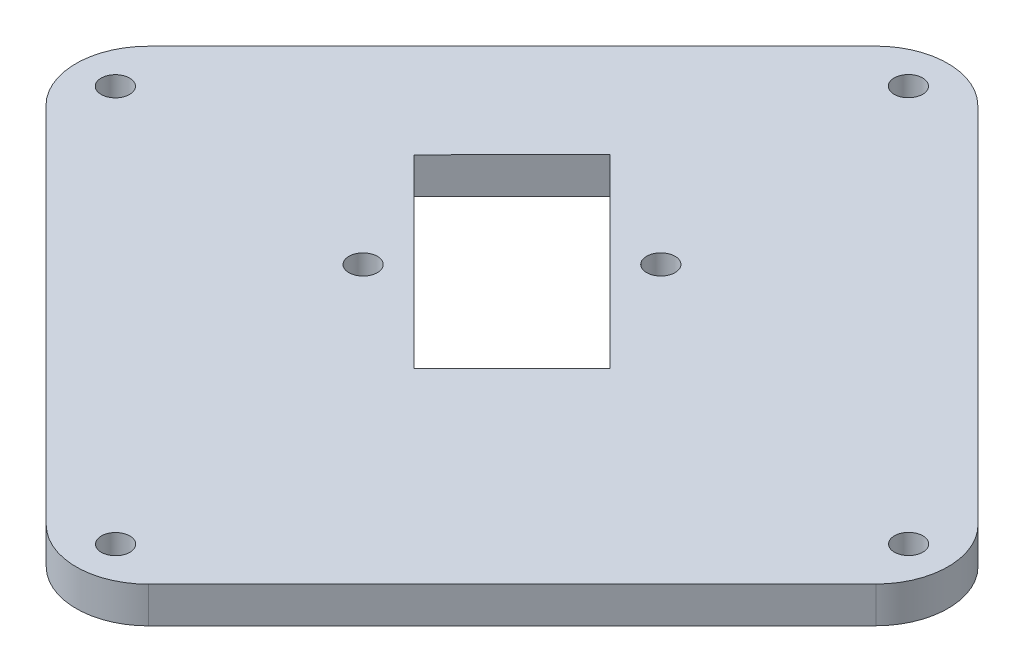
ISO-10303-21;
HEADER;
FILE_DESCRIPTION(('STEP AP214'),'2;1');
FILE_NAME('part.step','',(''),(''),'','','');
FILE_SCHEMA(('AUTOMOTIVE_DESIGN { 1 0 10303 214 1 1 1 1 }'));
ENDSEC;
DATA;
#1=APPLICATION_CONTEXT('core data for automotive mechanical design processes');
#2=APPLICATION_PROTOCOL_DEFINITION('international standard','automotive_design',2000,#1);
#3=PRODUCT_CONTEXT('',#1,'mechanical');
#4=PRODUCT('Part','Part','',(#3));
#5=PRODUCT_RELATED_PRODUCT_CATEGORY('part','',(#4));
#6=PRODUCT_DEFINITION_FORMATION('','',#4);
#7=PRODUCT_DEFINITION_CONTEXT('part definition',#1,'design');
#8=PRODUCT_DEFINITION('design','',#6,#7);
#9=PRODUCT_DEFINITION_SHAPE('','',#8);
#10=(LENGTH_UNIT() NAMED_UNIT(*) SI_UNIT(.MILLI.,.METRE.));
#11=(NAMED_UNIT(*) PLANE_ANGLE_UNIT() SI_UNIT($,.RADIAN.));
#12=(NAMED_UNIT(*) SI_UNIT($,.STERADIAN.) SOLID_ANGLE_UNIT());
#13=UNCERTAINTY_MEASURE_WITH_UNIT(LENGTH_MEASURE(1.E-05),#10,'distance_accuracy_value','');
#14=(GEOMETRIC_REPRESENTATION_CONTEXT(3) GLOBAL_UNCERTAINTY_ASSIGNED_CONTEXT((#13)) GLOBAL_UNIT_ASSIGNED_CONTEXT((#10,
#11,#12)) REPRESENTATION_CONTEXT('',''));
#15=CARTESIAN_POINT('',(0.,0.,0.));
#16=DIRECTION('',(0.,0.,1.));
#17=DIRECTION('',(1.,0.,0.));
#18=AXIS2_PLACEMENT_3D('',#15,#16,#17);
#19=CARTESIAN_POINT('',(0.,3.175,0.));
#20=DIRECTION('',(0.,1.,0.));
#21=DIRECTION('',(0.,0.,1.));
#22=AXIS2_PLACEMENT_3D('',#19,#20,#21);
#23=PLANE('',#22);
#24=CARTESIAN_POINT('',(49.990509246549,3.175,-3.32599943174655));
#25=DIRECTION('',(0.,1.,0.));
#26=DIRECTION('',(0.,0.,1.));
#27=AXIS2_PLACEMENT_3D('',#24,#25,#26);
#28=CIRCLE('',#27,1.25);
#29=CARTESIAN_POINT('',(49.990509246549,3.175,-2.07599943174655));
#30=VERTEX_POINT('',#29);
#31=EDGE_CURVE('E172',#30,#30,#28,.T.);
#32=ORIENTED_EDGE('',*,*,#31,.F.);
#33=EDGE_LOOP('',(#32));
#34=FACE_BOUND('',#33,.T.);
#35=CARTESIAN_POINT('',(-19.6693987929127,3.175,-3.30403545654676));
#36=DIRECTION('',(0.,1.,0.));
#37=DIRECTION('',(0.,0.,1.));
#38=AXIS2_PLACEMENT_3D('',#35,#36,#37);
#39=CIRCLE('',#38,1.25);
#40=CARTESIAN_POINT('',(-19.6693987929127,3.175,-2.05403545654676));
#41=VERTEX_POINT('',#40);
#42=EDGE_CURVE('E184',#41,#41,#39,.T.);
#43=ORIENTED_EDGE('',*,*,#42,.F.);
#44=EDGE_LOOP('',(#43));
#45=FACE_BOUND('',#44,.T.);
#46=CARTESIAN_POINT('',(4.76898538185796,3.175,-0.628904830785669));
#47=DIRECTION('',(0.,1.,0.));
#48=DIRECTION('',(0.,0.,1.));
#49=AXIS2_PLACEMENT_3D('',#46,#47,#48);
#50=CIRCLE('',#49,1.25);
#51=CARTESIAN_POINT('',(4.76898538185796,3.175,0.62109516921433));
#52=VERTEX_POINT('',#51);
#53=EDGE_CURVE('E196',#52,#52,#50,.T.);
#54=ORIENTED_EDGE('',*,*,#53,.F.);
#55=EDGE_LOOP('',(#54));
#56=FACE_BOUND('',#55,.T.);
#57=DIRECTION('',(-0.706883853499556,0.,0.707329638613863));
#58=VECTOR('',#57,1.);
#59=CARTESIAN_POINT('',(15.1476582908573,3.175,-44.2388174032666));
#60=LINE('',#59,#58);
#61=CARTESIAN_POINT('',(10.6589458211352,3.175,-39.7472741980685));
#62=VERTEX_POINT('',#61);
#63=CARTESIAN_POINT('',(-21.2745322607073,3.175,-7.79365777368722));
#64=VERTEX_POINT('',#63);
#65=EDGE_CURVE('E210',#62,#64,#60,.T.);
#66=ORIENTED_EDGE('',*,*,#65,.T.);
#67=CARTESIAN_POINT('',(-16.7829890555093,3.175,-3.30494530396506));
#68=DIRECTION('',(0.,1.,0.));
#69=DIRECTION('',(0.,0.,1.));
#70=AXIS2_PLACEMENT_3D('',#67,#68,#69);
#71=CIRCLE('',#70,6.35);
#72=CARTESIAN_POINT('',(-21.2717015252314,3.175,1.18659790123297));
#73=VERTEX_POINT('',#72);
#74=EDGE_CURVE('E245',#64,#73,#71,.T.);
#75=ORIENTED_EDGE('',*,*,#74,.T.);
#76=DIRECTION('',(0.707329638613863,0.,0.706883853499556));
#77=VECTOR('',#76,1.);
#78=CARTESIAN_POINT('',(-25.7632447304295,3.175,-3.30211456848921));
#79=LINE('',#78,#77);
#80=CARTESIAN_POINT('',(10.6819148991499,3.175,33.1200759830754));
#81=VERTEX_POINT('',#80);
#82=EDGE_CURVE('E202',#73,#81,#79,.T.);
#83=ORIENTED_EDGE('',*,*,#82,.T.);
#84=CARTESIAN_POINT('',(15.170627368872,3.175,28.6285327778774));
#85=DIRECTION('',(0.,1.,0.));
#86=DIRECTION('',(0.,0.,1.));
#87=AXIS2_PLACEMENT_3D('',#84,#85,#86);
#88=CIRCLE('',#87,6.35);
#89=CARTESIAN_POINT('',(19.6621705740701,3.175,33.1172452475995));
#90=VERTEX_POINT('',#89);
#91=EDGE_CURVE('E241',#81,#90,#88,.T.);
#92=ORIENTED_EDGE('',*,*,#91,.T.);
#93=DIRECTION('',(0.706883853499556,0.,-0.707329638613863));
#94=VECTOR('',#93,1.);
#95=CARTESIAN_POINT('',(15.1734581043479,3.175,37.6087884527976));
#96=LINE('',#95,#94);
#97=CARTESIAN_POINT('',(51.5956486559125,3.175,1.16362882321828));
#98=VERTEX_POINT('',#97);
#99=EDGE_CURVE('E205',#90,#98,#96,.T.);
#100=ORIENTED_EDGE('',*,*,#99,.T.);
#101=CARTESIAN_POINT('',(47.1041054507145,3.175,-3.3250836465039));
#102=DIRECTION('',(0.,1.,0.));
#103=DIRECTION('',(0.,0.,1.));
#104=AXIS2_PLACEMENT_3D('',#101,#102,#103);
#105=CIRCLE('',#104,6.35);
#106=CARTESIAN_POINT('',(51.5928179204367,3.175,-7.81662685170192));
#107=VERTEX_POINT('',#106);
#108=EDGE_CURVE('E55',#98,#107,#105,.T.);
#109=ORIENTED_EDGE('',*,*,#108,.T.);
#110=DIRECTION('',(-0.707329638613863,0.,-0.706883853499556));
#111=VECTOR('',#110,1.);
#112=CARTESIAN_POINT('',(15.1476582908573,3.175,-44.2388174032666));
#113=LINE('',#112,#111);
#114=CARTESIAN_POINT('',(19.6392014960554,3.175,-39.7501049335444));
#115=VERTEX_POINT('',#114);
#116=EDGE_CURVE('E208',#107,#115,#113,.T.);
#117=ORIENTED_EDGE('',*,*,#116,.T.);
#118=CARTESIAN_POINT('',(15.1504890263332,3.175,-35.2585617283464));
#119=DIRECTION('',(0.,1.,0.));
#120=DIRECTION('',(0.,0.,1.));
#121=AXIS2_PLACEMENT_3D('',#118,#119,#120);
#122=CIRCLE('',#121,6.35);
#123=EDGE_CURVE('E243',#115,#62,#122,.T.);
#124=ORIENTED_EDGE('',*,*,#123,.T.);
#125=EDGE_LOOP('',(#66,#75,#83,#92,#100,#109,#117,#124));
#126=FACE_BOUND('',#125,.T.);
#127=CARTESIAN_POINT('',(17.8401160936888,3.175,-13.7082786443225));
#128=DIRECTION('',(0.,1.,0.));
#129=DIRECTION('',(0.,0.,1.));
#130=AXIS2_PLACEMENT_3D('',#127,#128,#129);
#131=CIRCLE('',#130,1.25);
#132=CARTESIAN_POINT('',(17.8401160936888,3.175,-12.4582786443225));
#133=VERTEX_POINT('',#132);
#134=EDGE_CURVE('E190',#133,#133,#131,.T.);
#135=ORIENTED_EDGE('',*,*,#134,.F.);
#136=EDGE_LOOP('',(#135));
#137=FACE_BOUND('',#136,.T.);
#138=CARTESIAN_POINT('',(15.1495791789148,3.175,-38.1449714657498));
#139=DIRECTION('',(0.,1.,0.));
#140=DIRECTION('',(0.,0.,1.));
#141=AXIS2_PLACEMENT_3D('',#138,#139,#140);
#142=CIRCLE('',#141,1.25);
#143=CARTESIAN_POINT('',(15.1495791789148,3.175,-36.8949714657498));
#144=VERTEX_POINT('',#143);
#145=EDGE_CURVE('E178',#144,#144,#142,.T.);
#146=ORIENTED_EDGE('',*,*,#145,.F.);
#147=EDGE_LOOP('',(#146));
#148=FACE_BOUND('',#147,.T.);
#149=CARTESIAN_POINT('',(15.1715372162903,3.175,31.5149425152809));
#150=DIRECTION('',(0.,1.,0.));
#151=DIRECTION('',(0.,0.,1.));
#152=AXIS2_PLACEMENT_3D('',#149,#150,#151);
#153=CIRCLE('',#152,1.25);
#154=CARTESIAN_POINT('',(15.1715372162903,3.175,32.7649425152809));
#155=VERTEX_POINT('',#154);
#156=EDGE_CURVE('E166',#155,#155,#153,.T.);
#157=ORIENTED_EDGE('',*,*,#156,.F.);
#158=EDGE_LOOP('',(#157));
#159=FACE_BOUND('',#158,.T.);
#160=DIRECTION('',(-0.707329638613864,0.,-0.706883853499555));
#161=VECTOR('',#160,1.);
#162=CARTESIAN_POINT('',(7.26333532872844,3.175,-19.823469226795));
#163=LINE('',#162,#161);
#164=CARTESIAN_POINT('',(23.517770424075,3.175,-3.57927827337517));
#165=VERTEX_POINT('',#164);
#166=CARTESIAN_POINT('',(7.26333532872844,3.175,-19.823469226795));
#167=VERTEX_POINT('',#166);
#168=EDGE_CURVE('E135',#165,#167,#163,.T.);
#169=ORIENTED_EDGE('',*,*,#168,.F.);
#170=DIRECTION('',(0.706883853499556,0.,-0.707329638613863));
#171=VECTOR('',#170,1.);
#172=CARTESIAN_POINT('',(23.517770424075,3.175,-3.57927827337517));
#173=LINE('',#172,#171);
#174=CARTESIAN_POINT('',(14.9015631337689,3.175,5.04236269168921));
#175=VERTEX_POINT('',#174);
#176=EDGE_CURVE('E125',#175,#165,#173,.T.);
#177=ORIENTED_EDGE('',*,*,#176,.F.);
#178=DIRECTION('',(0.707329638613864,0.,0.706883853499555));
#179=VECTOR('',#178,1.);
#180=CARTESIAN_POINT('',(14.9015631337689,3.175,5.04236269168921));
#181=LINE('',#180,#179);
#182=CARTESIAN_POINT('',(-1.35287196157764,3.175,-11.2018282617306));
#183=VERTEX_POINT('',#182);
#184=EDGE_CURVE('E150',#183,#175,#181,.T.);
#185=ORIENTED_EDGE('',*,*,#184,.F.);
#186=DIRECTION('',(-0.706883853499555,0.,0.707329638613864));
#187=VECTOR('',#186,1.);
#188=CARTESIAN_POINT('',(-1.35287196157764,3.175,-11.2018282617306));
#189=LINE('',#188,#187);
#190=EDGE_CURVE('E148',#167,#183,#189,.T.);
#191=ORIENTED_EDGE('',*,*,#190,.F.);
#192=EDGE_LOOP('',(#169,#177,#185,#191));
#193=FACE_BOUND('',#192,.T.);
#194=ADVANCED_FACE('F33',(#34,#45,#56,#126,#137,#148,#159,#193),#23,.T.);
#195=CARTESIAN_POINT('',(0.,0.,0.));
#196=DIRECTION('',(0.,1.,0.));
#197=DIRECTION('',(0.,0.,1.));
#198=AXIS2_PLACEMENT_3D('',#195,#196,#197);
#199=PLANE('',#198);
#200=CARTESIAN_POINT('',(15.1715372162903,0.,31.5149425152809));
#201=DIRECTION('',(0.,1.,0.));
#202=DIRECTION('',(0.,0.,1.));
#203=AXIS2_PLACEMENT_3D('',#200,#201,#202);
#204=CIRCLE('',#203,1.25);
#205=CARTESIAN_POINT('',(15.1715372162903,0.,32.7649425152809));
#206=VERTEX_POINT('',#205);
#207=EDGE_CURVE('E143',#206,#206,#204,.T.);
#208=ORIENTED_EDGE('',*,*,#207,.T.);
#209=EDGE_LOOP('',(#208));
#210=FACE_BOUND('',#209,.T.);
#211=CARTESIAN_POINT('',(49.990509246549,0.,-3.32599943174655));
#212=DIRECTION('',(0.,1.,0.));
#213=DIRECTION('',(0.,0.,1.));
#214=AXIS2_PLACEMENT_3D('',#211,#212,#213);
#215=CIRCLE('',#214,1.25);
#216=CARTESIAN_POINT('',(49.990509246549,0.,-2.07599943174655));
#217=VERTEX_POINT('',#216);
#218=EDGE_CURVE('E169',#217,#217,#215,.T.);
#219=ORIENTED_EDGE('',*,*,#218,.T.);
#220=EDGE_LOOP('',(#219));
#221=FACE_BOUND('',#220,.T.);
#222=CARTESIAN_POINT('',(15.1495791789148,0.,-38.1449714657498));
#223=DIRECTION('',(0.,1.,0.));
#224=DIRECTION('',(0.,0.,1.));
#225=AXIS2_PLACEMENT_3D('',#222,#223,#224);
#226=CIRCLE('',#225,1.25);
#227=CARTESIAN_POINT('',(15.1495791789148,0.,-36.8949714657498));
#228=VERTEX_POINT('',#227);
#229=EDGE_CURVE('E175',#228,#228,#226,.T.);
#230=ORIENTED_EDGE('',*,*,#229,.T.);
#231=EDGE_LOOP('',(#230));
#232=FACE_BOUND('',#231,.T.);
#233=CARTESIAN_POINT('',(-19.6693987929127,0.,-3.30403545654676));
#234=DIRECTION('',(0.,1.,0.));
#235=DIRECTION('',(0.,0.,1.));
#236=AXIS2_PLACEMENT_3D('',#233,#234,#235);
#237=CIRCLE('',#236,1.25);
#238=CARTESIAN_POINT('',(-19.6693987929127,0.,-2.05403545654676));
#239=VERTEX_POINT('',#238);
#240=EDGE_CURVE('E181',#239,#239,#237,.T.);
#241=ORIENTED_EDGE('',*,*,#240,.T.);
#242=EDGE_LOOP('',(#241));
#243=FACE_BOUND('',#242,.T.);
#244=CARTESIAN_POINT('',(17.8401160936888,0.,-13.7082786443225));
#245=DIRECTION('',(0.,1.,0.));
#246=DIRECTION('',(0.,0.,1.));
#247=AXIS2_PLACEMENT_3D('',#244,#245,#246);
#248=CIRCLE('',#247,1.25);
#249=CARTESIAN_POINT('',(17.8401160936888,0.,-12.4582786443225));
#250=VERTEX_POINT('',#249);
#251=EDGE_CURVE('E187',#250,#250,#248,.T.);
#252=ORIENTED_EDGE('',*,*,#251,.T.);
#253=EDGE_LOOP('',(#252));
#254=FACE_BOUND('',#253,.T.);
#255=CARTESIAN_POINT('',(4.76898538185796,0.,-0.628904830785669));
#256=DIRECTION('',(0.,1.,0.));
#257=DIRECTION('',(0.,0.,1.));
#258=AXIS2_PLACEMENT_3D('',#255,#256,#257);
#259=CIRCLE('',#258,1.25);
#260=CARTESIAN_POINT('',(4.76898538185796,0.,0.62109516921433));
#261=VERTEX_POINT('',#260);
#262=EDGE_CURVE('E193',#261,#261,#259,.T.);
#263=ORIENTED_EDGE('',*,*,#262,.T.);
#264=EDGE_LOOP('',(#263));
#265=FACE_BOUND('',#264,.T.);
#266=DIRECTION('',(0.707329638613863,0.,0.706883853499556));
#267=VECTOR('',#266,1.);
#268=CARTESIAN_POINT('',(-25.7632447304295,0.,-3.30211456848921));
#269=LINE('',#268,#267);
#270=CARTESIAN_POINT('',(-21.2717015252314,0.,1.18659790123297));
#271=VERTEX_POINT('',#270);
#272=CARTESIAN_POINT('',(10.6819148991499,0.,33.1200759830754));
#273=VERTEX_POINT('',#272);
#274=EDGE_CURVE('E199',#271,#273,#269,.T.);
#275=ORIENTED_EDGE('',*,*,#274,.F.);
#276=CARTESIAN_POINT('',(-16.7829890555093,0.,-3.30494530396506));
#277=DIRECTION('',(0.,1.,0.));
#278=DIRECTION('',(0.,0.,1.));
#279=AXIS2_PLACEMENT_3D('',#276,#277,#278);
#280=CIRCLE('',#279,6.35);
#281=CARTESIAN_POINT('',(-21.2745322607073,0.,-7.79365777368722));
#282=VERTEX_POINT('',#281);
#283=EDGE_CURVE('E233',#271,#282,#280,.F.);
#284=ORIENTED_EDGE('',*,*,#283,.T.);
#285=DIRECTION('',(-0.706883853499556,0.,0.707329638613863));
#286=VECTOR('',#285,1.);
#287=CARTESIAN_POINT('',(15.1476582908573,0.,-44.2388174032666));
#288=LINE('',#287,#286);
#289=CARTESIAN_POINT('',(10.6589458211352,0.,-39.7472741980685));
#290=VERTEX_POINT('',#289);
#291=EDGE_CURVE('E206',#290,#282,#288,.T.);
#292=ORIENTED_EDGE('',*,*,#291,.F.);
#293=CARTESIAN_POINT('',(15.1504890263332,0.,-35.2585617283464));
#294=DIRECTION('',(0.,1.,0.));
#295=DIRECTION('',(0.,0.,1.));
#296=AXIS2_PLACEMENT_3D('',#293,#294,#295);
#297=CIRCLE('',#296,6.35);
#298=CARTESIAN_POINT('',(19.6392014960554,0.,-39.7501049335444));
#299=VERTEX_POINT('',#298);
#300=EDGE_CURVE('E231',#290,#299,#297,.F.);
#301=ORIENTED_EDGE('',*,*,#300,.T.);
#302=DIRECTION('',(-0.707329638613863,0.,-0.706883853499556));
#303=VECTOR('',#302,1.);
#304=CARTESIAN_POINT('',(15.1476582908573,0.,-44.2388174032666));
#305=LINE('',#304,#303);
#306=CARTESIAN_POINT('',(51.5928179204367,0.,-7.81662685170192));
#307=VERTEX_POINT('',#306);
#308=EDGE_CURVE('E219',#307,#299,#305,.T.);
#309=ORIENTED_EDGE('',*,*,#308,.F.);
#310=CARTESIAN_POINT('',(47.1041054507145,0.,-3.3250836465039));
#311=DIRECTION('',(0.,1.,0.));
#312=DIRECTION('',(0.,0.,1.));
#313=AXIS2_PLACEMENT_3D('',#310,#311,#312);
#314=CIRCLE('',#313,6.35);
#315=CARTESIAN_POINT('',(51.5956486559125,0.,1.16362882321828));
#316=VERTEX_POINT('',#315);
#317=EDGE_CURVE('E227',#307,#316,#314,.F.);
#318=ORIENTED_EDGE('',*,*,#317,.T.);
#319=DIRECTION('',(0.706883853499556,0.,-0.707329638613863));
#320=VECTOR('',#319,1.);
#321=CARTESIAN_POINT('',(15.1734581043479,0.,37.6087884527976));
#322=LINE('',#321,#320);
#323=CARTESIAN_POINT('',(19.6621705740701,0.,33.1172452475995));
#324=VERTEX_POINT('',#323);
#325=EDGE_CURVE('E216',#324,#316,#322,.T.);
#326=ORIENTED_EDGE('',*,*,#325,.F.);
#327=CARTESIAN_POINT('',(15.170627368872,0.,28.6285327778774));
#328=DIRECTION('',(0.,1.,0.));
#329=DIRECTION('',(0.,0.,1.));
#330=AXIS2_PLACEMENT_3D('',#327,#328,#329);
#331=CIRCLE('',#330,6.35);
#332=EDGE_CURVE('E229',#324,#273,#331,.F.);
#333=ORIENTED_EDGE('',*,*,#332,.T.);
#334=EDGE_LOOP('',(#275,#284,#292,#301,#309,#318,#326,#333));
#335=FACE_BOUND('',#334,.T.);
#336=DIRECTION('',(0.706883853499556,0.,-0.707329638613863));
#337=VECTOR('',#336,1.);
#338=CARTESIAN_POINT('',(23.517770424075,0.,-3.57927827337517));
#339=LINE('',#338,#337);
#340=CARTESIAN_POINT('',(14.9015631337689,0.,5.04236269168922));
#341=VERTEX_POINT('',#340);
#342=CARTESIAN_POINT('',(23.517770424075,0.,-3.57927827337517));
#343=VERTEX_POINT('',#342);
#344=EDGE_CURVE('E154',#341,#343,#339,.T.);
#345=ORIENTED_EDGE('',*,*,#344,.T.);
#346=DIRECTION('',(-0.707329638613864,0.,-0.706883853499555));
#347=VECTOR('',#346,1.);
#348=CARTESIAN_POINT('',(7.26333532872844,0.,-19.823469226795));
#349=LINE('',#348,#347);
#350=CARTESIAN_POINT('',(7.26333532872844,0.,-19.823469226795));
#351=VERTEX_POINT('',#350);
#352=EDGE_CURVE('E142',#343,#351,#349,.T.);
#353=ORIENTED_EDGE('',*,*,#352,.T.);
#354=DIRECTION('',(-0.706883853499555,0.,0.707329638613864));
#355=VECTOR('',#354,1.);
#356=CARTESIAN_POINT('',(-1.35287196157764,0.,-11.2018282617306));
#357=LINE('',#356,#355);
#358=CARTESIAN_POINT('',(-1.35287196157764,0.,-11.2018282617306));
#359=VERTEX_POINT('',#358);
#360=EDGE_CURVE('E157',#351,#359,#357,.T.);
#361=ORIENTED_EDGE('',*,*,#360,.T.);
#362=DIRECTION('',(0.707329638613864,0.,0.706883853499555));
#363=VECTOR('',#362,1.);
#364=CARTESIAN_POINT('',(14.9015631337689,0.,5.04236269168921));
#365=LINE('',#364,#363);
#366=EDGE_CURVE('E136',#359,#341,#365,.T.);
#367=ORIENTED_EDGE('',*,*,#366,.T.);
#368=EDGE_LOOP('',(#345,#353,#361,#367));
#369=FACE_BOUND('',#368,.T.);
#370=ADVANCED_FACE('F264',(#210,#221,#232,#243,#254,#265,#335,#369),#199,.F.);
#371=CARTESIAN_POINT('',(-25.7632447304295,3.175,-3.30211456848921));
#372=DIRECTION('',(0.706883853499556,0.,-0.707329638613863));
#373=DIRECTION('',(-0.707329638613864,0.,-0.706883853499556));
#374=AXIS2_PLACEMENT_3D('',#371,#372,#373);
#375=PLANE('',#374);
#376=ORIENTED_EDGE('',*,*,#82,.F.);
#377=DIRECTION('',(0.,-1.,0.));
#378=VECTOR('',#377,1.);
#379=CARTESIAN_POINT('',(-21.2717015252314,3.175,1.18659790123297));
#380=LINE('',#379,#378);
#381=EDGE_CURVE('E224',#73,#271,#380,.T.);
#382=ORIENTED_EDGE('',*,*,#381,.T.);
#383=ORIENTED_EDGE('',*,*,#274,.T.);
#384=DIRECTION('',(0.,-1.,0.));
#385=VECTOR('',#384,1.);
#386=CARTESIAN_POINT('',(10.6819148991499,3.175,33.1200759830754));
#387=LINE('',#386,#385);
#388=EDGE_CURVE('E213',#273,#81,#387,.F.);
#389=ORIENTED_EDGE('',*,*,#388,.T.);
#390=EDGE_LOOP('',(#376,#382,#383,#389));
#391=FACE_BOUND('',#390,.T.);
#392=ADVANCED_FACE('F281',(#391),#375,.F.);
#393=CARTESIAN_POINT('',(15.1734581043479,3.175,37.6087884527976));
#394=DIRECTION('',(-0.707329638613863,0.,-0.706883853499556));
#395=DIRECTION('',(-0.706883853499556,0.,0.707329638613863));
#396=AXIS2_PLACEMENT_3D('',#393,#394,#395);
#397=PLANE('',#396);
#398=ORIENTED_EDGE('',*,*,#99,.F.);
#399=DIRECTION('',(0.,-1.,0.));
#400=VECTOR('',#399,1.);
#401=CARTESIAN_POINT('',(19.6621705740701,3.175,33.1172452475995));
#402=LINE('',#401,#400);
#403=EDGE_CURVE('E11',#90,#324,#402,.T.);
#404=ORIENTED_EDGE('',*,*,#403,.T.);
#405=ORIENTED_EDGE('',*,*,#325,.T.);
#406=DIRECTION('',(0.,-1.,0.));
#407=VECTOR('',#406,1.);
#408=CARTESIAN_POINT('',(51.5956486559125,3.175,1.16362882321828));
#409=LINE('',#408,#407);
#410=EDGE_CURVE('E41',#316,#98,#409,.F.);
#411=ORIENTED_EDGE('',*,*,#410,.T.);
#412=EDGE_LOOP('',(#398,#404,#405,#411));
#413=FACE_BOUND('',#412,.T.);
#414=ADVANCED_FACE('F253',(#413),#397,.F.);
#415=CARTESIAN_POINT('',(15.1476582908573,3.175,-44.2388174032666));
#416=DIRECTION('',(-0.706883853499556,0.,0.707329638613863));
#417=DIRECTION('',(0.707329638613863,0.,0.706883853499556));
#418=AXIS2_PLACEMENT_3D('',#415,#416,#417);
#419=PLANE('',#418);
#420=ORIENTED_EDGE('',*,*,#308,.T.);
#421=DIRECTION('',(0.,-1.,0.));
#422=VECTOR('',#421,1.);
#423=CARTESIAN_POINT('',(19.6392014960554,3.175,-39.7501049335444));
#424=LINE('',#423,#422);
#425=EDGE_CURVE('E48',#299,#115,#424,.F.);
#426=ORIENTED_EDGE('',*,*,#425,.T.);
#427=ORIENTED_EDGE('',*,*,#116,.F.);
#428=DIRECTION('',(0.,-1.,0.));
#429=VECTOR('',#428,1.);
#430=CARTESIAN_POINT('',(51.5928179204367,3.175,-7.81662685170193));
#431=LINE('',#430,#429);
#432=EDGE_CURVE('E247',#107,#307,#431,.T.);
#433=ORIENTED_EDGE('',*,*,#432,.T.);
#434=EDGE_LOOP('',(#420,#426,#427,#433));
#435=FACE_BOUND('',#434,.T.);
#436=ADVANCED_FACE('F261',(#435),#419,.F.);
#437=CARTESIAN_POINT('',(15.1476582908573,3.175,-44.2388174032666));
#438=DIRECTION('',(0.707329638613863,0.,0.706883853499556));
#439=DIRECTION('',(0.706883853499556,0.,-0.707329638613863));
#440=AXIS2_PLACEMENT_3D('',#437,#438,#439);
#441=PLANE('',#440);
#442=ORIENTED_EDGE('',*,*,#291,.T.);
#443=DIRECTION('',(0.,-1.,0.));
#444=VECTOR('',#443,1.);
#445=CARTESIAN_POINT('',(-21.2745322607073,3.175,-7.79365777368723));
#446=LINE('',#445,#444);
#447=EDGE_CURVE('E238',#282,#64,#446,.F.);
#448=ORIENTED_EDGE('',*,*,#447,.T.);
#449=ORIENTED_EDGE('',*,*,#65,.F.);
#450=DIRECTION('',(0.,-1.,0.));
#451=VECTOR('',#450,1.);
#452=CARTESIAN_POINT('',(10.6589458211352,3.175,-39.7472741980685));
#453=LINE('',#452,#451);
#454=EDGE_CURVE('E235',#62,#290,#453,.T.);
#455=ORIENTED_EDGE('',*,*,#454,.T.);
#456=EDGE_LOOP('',(#442,#448,#449,#455));
#457=FACE_BOUND('',#456,.T.);
#458=ADVANCED_FACE('F273',(#457),#441,.F.);
#459=CARTESIAN_POINT('',(4.76898538185796,3.175,-0.628904830785669));
#460=DIRECTION('',(0.,-1.,0.));
#461=DIRECTION('',(0.,0.,-1.));
#462=AXIS2_PLACEMENT_3D('',#459,#460,#461);
#463=CYLINDRICAL_SURFACE('',#462,1.25);
#464=ORIENTED_EDGE('',*,*,#53,.T.);
#465=EDGE_LOOP('',(#464));
#466=FACE_BOUND('',#465,.T.);
#467=ORIENTED_EDGE('',*,*,#262,.F.);
#468=EDGE_LOOP('',(#467));
#469=FACE_BOUND('',#468,.T.);
#470=ADVANCED_FACE('F302',(#466,#469),#463,.F.);
#471=CARTESIAN_POINT('',(17.8401160936888,3.175,-13.7082786443225));
#472=DIRECTION('',(0.,-1.,0.));
#473=DIRECTION('',(0.,0.,-1.));
#474=AXIS2_PLACEMENT_3D('',#471,#472,#473);
#475=CYLINDRICAL_SURFACE('',#474,1.25);
#476=ORIENTED_EDGE('',*,*,#134,.T.);
#477=EDGE_LOOP('',(#476));
#478=FACE_BOUND('',#477,.T.);
#479=ORIENTED_EDGE('',*,*,#251,.F.);
#480=EDGE_LOOP('',(#479));
#481=FACE_BOUND('',#480,.T.);
#482=ADVANCED_FACE('F346',(#478,#481),#475,.F.);
#483=CARTESIAN_POINT('',(-19.6693987929127,3.175,-3.30403545654676));
#484=DIRECTION('',(0.,-1.,0.));
#485=DIRECTION('',(0.,0.,-1.));
#486=AXIS2_PLACEMENT_3D('',#483,#484,#485);
#487=CYLINDRICAL_SURFACE('',#486,1.25);
#488=ORIENTED_EDGE('',*,*,#42,.T.);
#489=EDGE_LOOP('',(#488));
#490=FACE_BOUND('',#489,.T.);
#491=ORIENTED_EDGE('',*,*,#240,.F.);
#492=EDGE_LOOP('',(#491));
#493=FACE_BOUND('',#492,.T.);
#494=ADVANCED_FACE('F343',(#490,#493),#487,.F.);
#495=CARTESIAN_POINT('',(15.1495791789148,3.175,-38.1449714657498));
#496=DIRECTION('',(0.,-1.,0.));
#497=DIRECTION('',(0.,0.,-1.));
#498=AXIS2_PLACEMENT_3D('',#495,#496,#497);
#499=CYLINDRICAL_SURFACE('',#498,1.25);
#500=ORIENTED_EDGE('',*,*,#145,.T.);
#501=EDGE_LOOP('',(#500));
#502=FACE_BOUND('',#501,.T.);
#503=ORIENTED_EDGE('',*,*,#229,.F.);
#504=EDGE_LOOP('',(#503));
#505=FACE_BOUND('',#504,.T.);
#506=ADVANCED_FACE('F339',(#502,#505),#499,.F.);
#507=CARTESIAN_POINT('',(49.990509246549,3.175,-3.32599943174655));
#508=DIRECTION('',(0.,-1.,0.));
#509=DIRECTION('',(0.,0.,-1.));
#510=AXIS2_PLACEMENT_3D('',#507,#508,#509);
#511=CYLINDRICAL_SURFACE('',#510,1.25);
#512=ORIENTED_EDGE('',*,*,#31,.T.);
#513=EDGE_LOOP('',(#512));
#514=FACE_BOUND('',#513,.T.);
#515=ORIENTED_EDGE('',*,*,#218,.F.);
#516=EDGE_LOOP('',(#515));
#517=FACE_BOUND('',#516,.T.);
#518=ADVANCED_FACE('F335',(#514,#517),#511,.F.);
#519=CARTESIAN_POINT('',(15.1715372162903,3.175,31.5149425152809));
#520=DIRECTION('',(0.,-1.,0.));
#521=DIRECTION('',(0.,0.,-1.));
#522=AXIS2_PLACEMENT_3D('',#519,#520,#521);
#523=CYLINDRICAL_SURFACE('',#522,1.25);
#524=ORIENTED_EDGE('',*,*,#156,.T.);
#525=EDGE_LOOP('',(#524));
#526=FACE_BOUND('',#525,.T.);
#527=ORIENTED_EDGE('',*,*,#207,.F.);
#528=EDGE_LOOP('',(#527));
#529=FACE_BOUND('',#528,.T.);
#530=ADVANCED_FACE('F332',(#526,#529),#523,.F.);
#531=CARTESIAN_POINT('',(23.517770424075,3.175,-3.57927827337517));
#532=DIRECTION('',(-0.707329638613863,0.,-0.706883853499556));
#533=DIRECTION('',(-0.706883853499556,0.,0.707329638613864));
#534=AXIS2_PLACEMENT_3D('',#531,#532,#533);
#535=PLANE('',#534);
#536=ORIENTED_EDGE('',*,*,#344,.F.);
#537=DIRECTION('',(0.,-1.,0.));
#538=VECTOR('',#537,1.);
#539=CARTESIAN_POINT('',(14.9015631337689,3.175,5.04236269168921));
#540=LINE('',#539,#538);
#541=EDGE_CURVE('E131',#175,#341,#540,.T.);
#542=ORIENTED_EDGE('',*,*,#541,.F.);
#543=ORIENTED_EDGE('',*,*,#176,.T.);
#544=DIRECTION('',(0.,-1.,0.));
#545=VECTOR('',#544,1.);
#546=CARTESIAN_POINT('',(23.517770424075,3.175,-3.57927827337517));
#547=LINE('',#546,#545);
#548=EDGE_CURVE('E128',#165,#343,#547,.T.);
#549=ORIENTED_EDGE('',*,*,#548,.T.);
#550=EDGE_LOOP('',(#536,#542,#543,#549));
#551=FACE_BOUND('',#550,.T.);
#552=ADVANCED_FACE('F127',(#551),#535,.T.);
#553=CARTESIAN_POINT('',(7.26333532872844,3.175,-19.823469226795));
#554=DIRECTION('',(-0.706883853499555,0.,0.707329638613864));
#555=DIRECTION('',(0.707329638613864,0.,0.706883853499555));
#556=AXIS2_PLACEMENT_3D('',#553,#554,#555);
#557=PLANE('',#556);
#558=ORIENTED_EDGE('',*,*,#352,.F.);
#559=ORIENTED_EDGE('',*,*,#548,.F.);
#560=ORIENTED_EDGE('',*,*,#168,.T.);
#561=DIRECTION('',(0.,-1.,0.));
#562=VECTOR('',#561,1.);
#563=CARTESIAN_POINT('',(7.26333532872844,3.175,-19.823469226795));
#564=LINE('',#563,#562);
#565=EDGE_CURVE('E144',#167,#351,#564,.T.);
#566=ORIENTED_EDGE('',*,*,#565,.T.);
#567=EDGE_LOOP('',(#558,#559,#560,#566));
#568=FACE_BOUND('',#567,.T.);
#569=ADVANCED_FACE('F139',(#568),#557,.T.);
#570=CARTESIAN_POINT('',(-1.35287196157764,3.175,-11.2018282617306));
#571=DIRECTION('',(0.707329638613864,0.,0.706883853499555));
#572=DIRECTION('',(0.706883853499555,0.,-0.707329638613864));
#573=AXIS2_PLACEMENT_3D('',#570,#571,#572);
#574=PLANE('',#573);
#575=ORIENTED_EDGE('',*,*,#360,.F.);
#576=ORIENTED_EDGE('',*,*,#565,.F.);
#577=ORIENTED_EDGE('',*,*,#190,.T.);
#578=DIRECTION('',(0.,-1.,0.));
#579=VECTOR('',#578,1.);
#580=CARTESIAN_POINT('',(-1.35287196157764,3.175,-11.2018282617306));
#581=LINE('',#580,#579);
#582=EDGE_CURVE('E163',#183,#359,#581,.T.);
#583=ORIENTED_EDGE('',*,*,#582,.T.);
#584=EDGE_LOOP('',(#575,#576,#577,#583));
#585=FACE_BOUND('',#584,.T.);
#586=ADVANCED_FACE('F318',(#585),#574,.T.);
#587=CARTESIAN_POINT('',(14.9015631337689,3.175,5.04236269168921));
#588=DIRECTION('',(0.706883853499555,0.,-0.707329638613864));
#589=DIRECTION('',(-0.707329638613864,0.,-0.706883853499556));
#590=AXIS2_PLACEMENT_3D('',#587,#588,#589);
#591=PLANE('',#590);
#592=ORIENTED_EDGE('',*,*,#366,.F.);
#593=ORIENTED_EDGE('',*,*,#582,.F.);
#594=ORIENTED_EDGE('',*,*,#184,.T.);
#595=ORIENTED_EDGE('',*,*,#541,.T.);
#596=EDGE_LOOP('',(#592,#593,#594,#595));
#597=FACE_BOUND('',#596,.T.);
#598=ADVANCED_FACE('F314',(#597),#591,.T.);
#599=CARTESIAN_POINT('',(-16.7829890555093,3.175,-3.30494530396506));
#600=DIRECTION('',(0.,-1.,0.));
#601=DIRECTION('',(0.,0.,-1.));
#602=AXIS2_PLACEMENT_3D('',#599,#600,#601);
#603=CYLINDRICAL_SURFACE('',#602,6.35);
#604=ORIENTED_EDGE('',*,*,#74,.F.);
#605=ORIENTED_EDGE('',*,*,#447,.F.);
#606=ORIENTED_EDGE('',*,*,#283,.F.);
#607=ORIENTED_EDGE('',*,*,#381,.F.);
#608=EDGE_LOOP('',(#604,#605,#606,#607));
#609=FACE_BOUND('',#608,.T.);
#610=ADVANCED_FACE('F279',(#609),#603,.T.);
#611=CARTESIAN_POINT('',(15.1504890263332,3.175,-35.2585617283464));
#612=DIRECTION('',(0.,-1.,0.));
#613=DIRECTION('',(0.,0.,-1.));
#614=AXIS2_PLACEMENT_3D('',#611,#612,#613);
#615=CYLINDRICAL_SURFACE('',#614,6.35);
#616=ORIENTED_EDGE('',*,*,#123,.F.);
#617=ORIENTED_EDGE('',*,*,#425,.F.);
#618=ORIENTED_EDGE('',*,*,#300,.F.);
#619=ORIENTED_EDGE('',*,*,#454,.F.);
#620=EDGE_LOOP('',(#616,#617,#618,#619));
#621=FACE_BOUND('',#620,.T.);
#622=ADVANCED_FACE('F270',(#621),#615,.T.);
#623=CARTESIAN_POINT('',(15.170627368872,3.175,28.6285327778774));
#624=DIRECTION('',(0.,-1.,0.));
#625=DIRECTION('',(0.,0.,-1.));
#626=AXIS2_PLACEMENT_3D('',#623,#624,#625);
#627=CYLINDRICAL_SURFACE('',#626,6.35);
#628=ORIENTED_EDGE('',*,*,#91,.F.);
#629=ORIENTED_EDGE('',*,*,#388,.F.);
#630=ORIENTED_EDGE('',*,*,#332,.F.);
#631=ORIENTED_EDGE('',*,*,#403,.F.);
#632=EDGE_LOOP('',(#628,#629,#630,#631));
#633=FACE_BOUND('',#632,.T.);
#634=ADVANCED_FACE('F284',(#633),#627,.T.);
#635=CARTESIAN_POINT('',(47.1041054507145,3.175,-3.3250836465039));
#636=DIRECTION('',(0.,-1.,0.));
#637=DIRECTION('',(0.,0.,-1.));
#638=AXIS2_PLACEMENT_3D('',#635,#636,#637);
#639=CYLINDRICAL_SURFACE('',#638,6.35);
#640=ORIENTED_EDGE('',*,*,#108,.F.);
#641=ORIENTED_EDGE('',*,*,#410,.F.);
#642=ORIENTED_EDGE('',*,*,#317,.F.);
#643=ORIENTED_EDGE('',*,*,#432,.F.);
#644=EDGE_LOOP('',(#640,#641,#642,#643));
#645=FACE_BOUND('',#644,.T.);
#646=ADVANCED_FACE('F35',(#645),#639,.T.);
#647=CLOSED_SHELL('',(#194,#370,#392,#414,#436,#458,#470,#482,#494,#506,#518,#530,#552,#569,
#586,#598,#610,#622,#634,#646));
#648=MANIFOLD_SOLID_BREP('B2',#647);
#649=ADVANCED_BREP_SHAPE_REPRESENTATION('',(#18,#648),#14);
#650=SHAPE_DEFINITION_REPRESENTATION(#9,#649);
ENDSEC;
END-ISO-10303-21;
